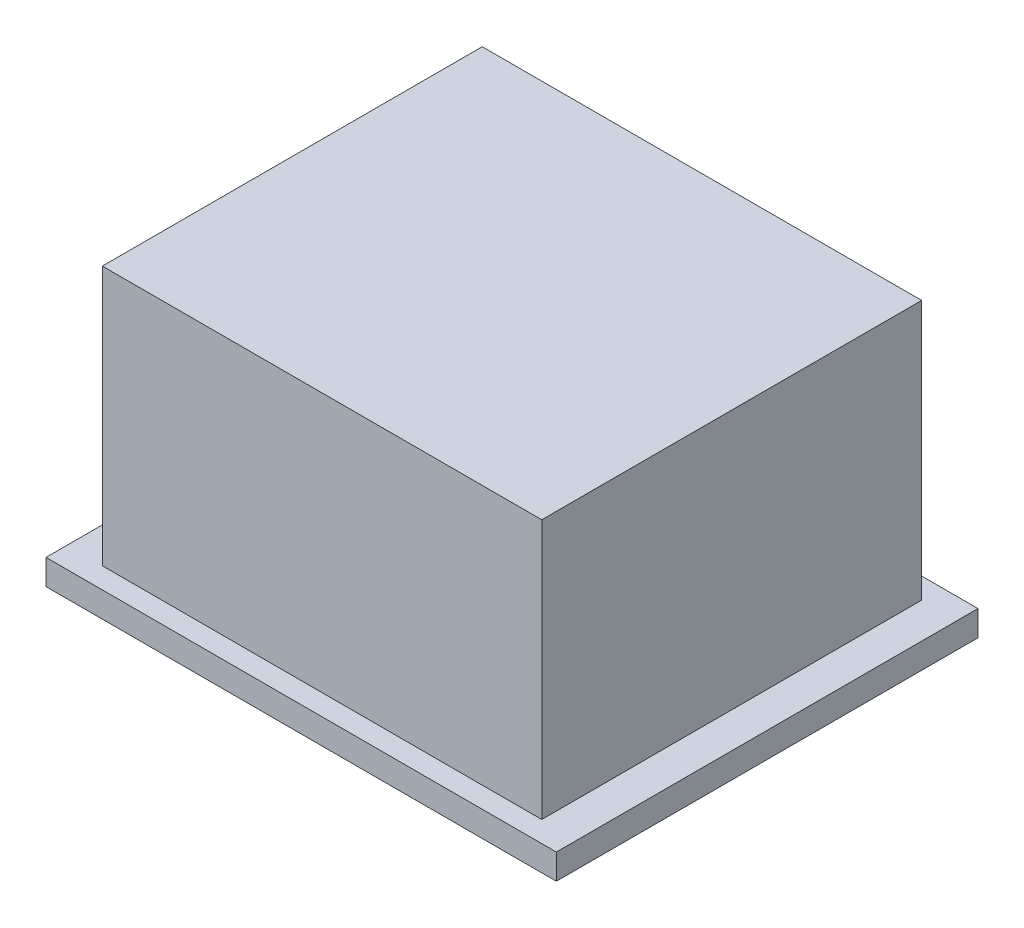
ISO-10303-21;
HEADER;
FILE_DESCRIPTION(('STEP AP214'),'2;1');
FILE_NAME('part.step','',(''),(''),'','','');
FILE_SCHEMA(('AUTOMOTIVE_DESIGN { 1 0 10303 214 1 1 1 1 }'));
ENDSEC;
DATA;
#1=APPLICATION_CONTEXT('core data for automotive mechanical design processes');
#2=APPLICATION_PROTOCOL_DEFINITION('international standard','automotive_design',2000,#1);
#3=PRODUCT_CONTEXT('',#1,'mechanical');
#4=PRODUCT('Part','Part','',(#3));
#5=PRODUCT_RELATED_PRODUCT_CATEGORY('part','',(#4));
#6=PRODUCT_DEFINITION_FORMATION('','',#4);
#7=PRODUCT_DEFINITION_CONTEXT('part definition',#1,'design');
#8=PRODUCT_DEFINITION('design','',#6,#7);
#9=PRODUCT_DEFINITION_SHAPE('','',#8);
#10=(LENGTH_UNIT() NAMED_UNIT(*) SI_UNIT(.MILLI.,.METRE.));
#11=(NAMED_UNIT(*) PLANE_ANGLE_UNIT() SI_UNIT($,.RADIAN.));
#12=(NAMED_UNIT(*) SI_UNIT($,.STERADIAN.) SOLID_ANGLE_UNIT());
#13=UNCERTAINTY_MEASURE_WITH_UNIT(LENGTH_MEASURE(1.E-05),#10,'distance_accuracy_value','');
#14=(GEOMETRIC_REPRESENTATION_CONTEXT(3) GLOBAL_UNCERTAINTY_ASSIGNED_CONTEXT((#13)) GLOBAL_UNIT_ASSIGNED_CONTEXT((#10,
#11,#12)) REPRESENTATION_CONTEXT('',''));
#15=CARTESIAN_POINT('',(0.,0.,0.));
#16=DIRECTION('',(0.,0.,1.));
#17=DIRECTION('',(1.,0.,0.));
#18=AXIS2_PLACEMENT_3D('',#15,#16,#17);
#19=CARTESIAN_POINT('',(0.,2.,0.));
#20=DIRECTION('',(0.,-1.,0.));
#21=DIRECTION('',(0.,0.,-1.));
#22=AXIS2_PLACEMENT_3D('',#19,#20,#21);
#23=PLANE('',#22);
#24=DIRECTION('',(0.,0.,1.));
#25=VECTOR('',#24,1.);
#26=CARTESIAN_POINT('',(0.,2.,0.));
#27=LINE('',#26,#25);
#28=CARTESIAN_POINT('',(0.,2.,-33.3));
#29=VERTEX_POINT('',#28);
#30=CARTESIAN_POINT('',(0.,2.,0.));
#31=VERTEX_POINT('',#30);
#32=EDGE_CURVE('E127',#29,#31,#27,.T.);
#33=ORIENTED_EDGE('',*,*,#32,.T.);
#34=DIRECTION('',(1.,0.,0.));
#35=VECTOR('',#34,1.);
#36=CARTESIAN_POINT('',(0.,2.,0.));
#37=LINE('',#36,#35);
#38=CARTESIAN_POINT('',(40.3,2.,0.));
#39=VERTEX_POINT('',#38);
#40=EDGE_CURVE('E130',#31,#39,#37,.T.);
#41=ORIENTED_EDGE('',*,*,#40,.T.);
#42=DIRECTION('',(0.,0.,-1.));
#43=VECTOR('',#42,1.);
#44=CARTESIAN_POINT('',(40.3,2.,0.));
#45=LINE('',#44,#43);
#46=CARTESIAN_POINT('',(40.3,2.,-33.3));
#47=VERTEX_POINT('',#46);
#48=EDGE_CURVE('E133',#39,#47,#45,.T.);
#49=ORIENTED_EDGE('',*,*,#48,.T.);
#50=DIRECTION('',(-1.,0.,0.));
#51=VECTOR('',#50,1.);
#52=CARTESIAN_POINT('',(0.,2.,-33.3));
#53=LINE('',#52,#51);
#54=EDGE_CURVE('E135',#47,#29,#53,.T.);
#55=ORIENTED_EDGE('',*,*,#54,.T.);
#56=EDGE_LOOP('',(#33,#41,#49,#55));
#57=FACE_BOUND('',#56,.T.);
#58=DIRECTION('',(0.,0.,-1.));
#59=VECTOR('',#58,1.);
#60=CARTESIAN_POINT('',(37.5,2.,-1.65000000000001));
#61=LINE('',#60,#59);
#62=CARTESIAN_POINT('',(37.5,2.,-1.65000000000001));
#63=VERTEX_POINT('',#62);
#64=CARTESIAN_POINT('',(37.5,2.,-31.65));
#65=VERTEX_POINT('',#64);
#66=EDGE_CURVE('E48',#63,#65,#61,.T.);
#67=ORIENTED_EDGE('',*,*,#66,.F.);
#68=DIRECTION('',(1.,0.,0.));
#69=VECTOR('',#68,1.);
#70=CARTESIAN_POINT('',(2.8,2.,-1.65000000000001));
#71=LINE('',#70,#69);
#72=CARTESIAN_POINT('',(2.8,2.,-1.65000000000001));
#73=VERTEX_POINT('',#72);
#74=EDGE_CURVE('E52',#73,#63,#71,.T.);
#75=ORIENTED_EDGE('',*,*,#74,.F.);
#76=DIRECTION('',(0.,0.,1.));
#77=VECTOR('',#76,1.);
#78=CARTESIAN_POINT('',(2.8,2.,-1.65000000000001));
#79=LINE('',#78,#77);
#80=CARTESIAN_POINT('',(2.8,2.,-31.65));
#81=VERTEX_POINT('',#80);
#82=EDGE_CURVE('E260',#81,#73,#79,.T.);
#83=ORIENTED_EDGE('',*,*,#82,.F.);
#84=DIRECTION('',(-1.,0.,0.));
#85=VECTOR('',#84,1.);
#86=CARTESIAN_POINT('',(2.8,2.,-31.65));
#87=LINE('',#86,#85);
#88=EDGE_CURVE('E266',#65,#81,#87,.T.);
#89=ORIENTED_EDGE('',*,*,#88,.F.);
#90=EDGE_LOOP('',(#67,#75,#83,#89));
#91=FACE_BOUND('',#90,.T.);
#92=ADVANCED_FACE('F33',(#57,#91),#23,.F.);
#93=CARTESIAN_POINT('',(0.,2.,0.));
#94=DIRECTION('',(1.,0.,0.));
#95=DIRECTION('',(0.,0.,-1.));
#96=AXIS2_PLACEMENT_3D('',#93,#94,#95);
#97=PLANE('',#96);
#98=DIRECTION('',(0.,0.,1.));
#99=VECTOR('',#98,1.);
#100=CARTESIAN_POINT('',(0.,0.,0.));
#101=LINE('',#100,#99);
#102=CARTESIAN_POINT('',(0.,0.,-33.3));
#103=VERTEX_POINT('',#102);
#104=CARTESIAN_POINT('',(0.,0.,0.));
#105=VERTEX_POINT('',#104);
#106=EDGE_CURVE('E118',#103,#105,#101,.T.);
#107=ORIENTED_EDGE('',*,*,#106,.T.);
#108=DIRECTION('',(0.,-1.,0.));
#109=VECTOR('',#108,1.);
#110=CARTESIAN_POINT('',(0.,2.,0.));
#111=LINE('',#110,#109);
#112=EDGE_CURVE('E11',#31,#105,#111,.T.);
#113=ORIENTED_EDGE('',*,*,#112,.F.);
#114=ORIENTED_EDGE('',*,*,#32,.F.);
#115=DIRECTION('',(0.,-1.,0.));
#116=VECTOR('',#115,1.);
#117=CARTESIAN_POINT('',(0.,2.,-33.3));
#118=LINE('',#117,#116);
#119=EDGE_CURVE('E136',#29,#103,#118,.T.);
#120=ORIENTED_EDGE('',*,*,#119,.T.);
#121=EDGE_LOOP('',(#107,#113,#114,#120));
#122=FACE_BOUND('',#121,.T.);
#123=ADVANCED_FACE('F35',(#122),#97,.F.);
#124=CARTESIAN_POINT('',(0.,2.,0.));
#125=DIRECTION('',(0.,0.,-1.));
#126=DIRECTION('',(-1.,0.,0.));
#127=AXIS2_PLACEMENT_3D('',#124,#125,#126);
#128=PLANE('',#127);
#129=DIRECTION('',(1.,0.,0.));
#130=VECTOR('',#129,1.);
#131=CARTESIAN_POINT('',(0.,0.,0.));
#132=LINE('',#131,#130);
#133=CARTESIAN_POINT('',(40.3,0.,0.));
#134=VERTEX_POINT('',#133);
#135=EDGE_CURVE('E121',#105,#134,#132,.T.);
#136=ORIENTED_EDGE('',*,*,#135,.T.);
#137=DIRECTION('',(0.,-1.,0.));
#138=VECTOR('',#137,1.);
#139=CARTESIAN_POINT('',(40.3,2.,0.));
#140=LINE('',#139,#138);
#141=EDGE_CURVE('E41',#39,#134,#140,.T.);
#142=ORIENTED_EDGE('',*,*,#141,.F.);
#143=ORIENTED_EDGE('',*,*,#40,.F.);
#144=ORIENTED_EDGE('',*,*,#112,.T.);
#145=EDGE_LOOP('',(#136,#142,#143,#144));
#146=FACE_BOUND('',#145,.T.);
#147=ADVANCED_FACE('F166',(#146),#128,.F.);
#148=CARTESIAN_POINT('',(40.3,2.,0.));
#149=DIRECTION('',(-1.,0.,0.));
#150=DIRECTION('',(0.,0.,1.));
#151=AXIS2_PLACEMENT_3D('',#148,#149,#150);
#152=PLANE('',#151);
#153=DIRECTION('',(0.,0.,-1.));
#154=VECTOR('',#153,1.);
#155=CARTESIAN_POINT('',(40.3,0.,0.));
#156=LINE('',#155,#154);
#157=CARTESIAN_POINT('',(40.3,0.,-33.3));
#158=VERTEX_POINT('',#157);
#159=EDGE_CURVE('E139',#134,#158,#156,.T.);
#160=ORIENTED_EDGE('',*,*,#159,.T.);
#161=DIRECTION('',(0.,-1.,0.));
#162=VECTOR('',#161,1.);
#163=CARTESIAN_POINT('',(40.3,2.,-33.3));
#164=LINE('',#163,#162);
#165=EDGE_CURVE('E144',#47,#158,#164,.T.);
#166=ORIENTED_EDGE('',*,*,#165,.F.);
#167=ORIENTED_EDGE('',*,*,#48,.F.);
#168=ORIENTED_EDGE('',*,*,#141,.T.);
#169=EDGE_LOOP('',(#160,#166,#167,#168));
#170=FACE_BOUND('',#169,.T.);
#171=ADVANCED_FACE('F151',(#170),#152,.F.);
#172=CARTESIAN_POINT('',(0.,2.,-33.3));
#173=DIRECTION('',(0.,0.,1.));
#174=DIRECTION('',(1.,0.,0.));
#175=AXIS2_PLACEMENT_3D('',#172,#173,#174);
#176=PLANE('',#175);
#177=DIRECTION('',(-1.,0.,0.));
#178=VECTOR('',#177,1.);
#179=CARTESIAN_POINT('',(0.,0.,-33.3));
#180=LINE('',#179,#178);
#181=EDGE_CURVE('E131',#158,#103,#180,.T.);
#182=ORIENTED_EDGE('',*,*,#181,.T.);
#183=ORIENTED_EDGE('',*,*,#119,.F.);
#184=ORIENTED_EDGE('',*,*,#54,.F.);
#185=ORIENTED_EDGE('',*,*,#165,.T.);
#186=EDGE_LOOP('',(#182,#183,#184,#185));
#187=FACE_BOUND('',#186,.T.);
#188=ADVANCED_FACE('F160',(#187),#176,.F.);
#189=CARTESIAN_POINT('',(0.,0.,0.));
#190=DIRECTION('',(0.,-1.,0.));
#191=DIRECTION('',(0.,0.,-1.));
#192=AXIS2_PLACEMENT_3D('',#189,#190,#191);
#193=PLANE('',#192);
#194=ORIENTED_EDGE('',*,*,#106,.F.);
#195=ORIENTED_EDGE('',*,*,#181,.F.);
#196=ORIENTED_EDGE('',*,*,#159,.F.);
#197=ORIENTED_EDGE('',*,*,#135,.F.);
#198=EDGE_LOOP('',(#194,#195,#196,#197));
#199=FACE_BOUND('',#198,.T.);
#200=ADVANCED_FACE('F157',(#199),#193,.T.);
#201=CARTESIAN_POINT('',(37.5,22.5,-1.65000000000001));
#202=DIRECTION('',(-1.,0.,0.));
#203=DIRECTION('',(0.,0.,1.));
#204=AXIS2_PLACEMENT_3D('',#201,#202,#203);
#205=PLANE('',#204);
#206=ORIENTED_EDGE('',*,*,#66,.T.);
#207=DIRECTION('',(0.,-1.,0.));
#208=VECTOR('',#207,1.);
#209=CARTESIAN_POINT('',(37.5,22.5,-31.65));
#210=LINE('',#209,#208);
#211=CARTESIAN_POINT('',(37.5,22.5,-31.65));
#212=VERTEX_POINT('',#211);
#213=EDGE_CURVE('E101',#212,#65,#210,.T.);
#214=ORIENTED_EDGE('',*,*,#213,.F.);
#215=DIRECTION('',(0.,0.,-1.));
#216=VECTOR('',#215,1.);
#217=CARTESIAN_POINT('',(37.5,22.5,-1.65000000000001));
#218=LINE('',#217,#216);
#219=CARTESIAN_POINT('',(37.5,22.5,-1.65000000000001));
#220=VERTEX_POINT('',#219);
#221=EDGE_CURVE('E107',#220,#212,#218,.T.);
#222=ORIENTED_EDGE('',*,*,#221,.F.);
#223=DIRECTION('',(0.,-1.,0.));
#224=VECTOR('',#223,1.);
#225=CARTESIAN_POINT('',(37.5,22.5,-1.65000000000001));
#226=LINE('',#225,#224);
#227=EDGE_CURVE('E258',#220,#63,#226,.T.);
#228=ORIENTED_EDGE('',*,*,#227,.T.);
#229=EDGE_LOOP('',(#206,#214,#222,#228));
#230=FACE_BOUND('',#229,.T.);
#231=ADVANCED_FACE('F117',(#230),#205,.F.);
#232=CARTESIAN_POINT('',(2.8,22.5,-31.65));
#233=DIRECTION('',(0.,0.,1.));
#234=DIRECTION('',(1.,0.,0.));
#235=AXIS2_PLACEMENT_3D('',#232,#233,#234);
#236=PLANE('',#235);
#237=ORIENTED_EDGE('',*,*,#88,.T.);
#238=DIRECTION('',(0.,-1.,0.));
#239=VECTOR('',#238,1.);
#240=CARTESIAN_POINT('',(2.8,22.5,-31.65));
#241=LINE('',#240,#239);
#242=CARTESIAN_POINT('',(2.8,22.5,-31.65));
#243=VERTEX_POINT('',#242);
#244=EDGE_CURVE('E103',#243,#81,#241,.T.);
#245=ORIENTED_EDGE('',*,*,#244,.F.);
#246=DIRECTION('',(-1.,0.,0.));
#247=VECTOR('',#246,1.);
#248=CARTESIAN_POINT('',(2.8,22.5,-31.65));
#249=LINE('',#248,#247);
#250=EDGE_CURVE('E96',#212,#243,#249,.T.);
#251=ORIENTED_EDGE('',*,*,#250,.F.);
#252=ORIENTED_EDGE('',*,*,#213,.T.);
#253=EDGE_LOOP('',(#237,#245,#251,#252));
#254=FACE_BOUND('',#253,.T.);
#255=ADVANCED_FACE('F99',(#254),#236,.F.);
#256=CARTESIAN_POINT('',(2.8,22.5,-1.65000000000001));
#257=DIRECTION('',(1.,0.,0.));
#258=DIRECTION('',(0.,0.,-1.));
#259=AXIS2_PLACEMENT_3D('',#256,#257,#258);
#260=PLANE('',#259);
#261=ORIENTED_EDGE('',*,*,#82,.T.);
#262=DIRECTION('',(0.,-1.,0.));
#263=VECTOR('',#262,1.);
#264=CARTESIAN_POINT('',(2.8,22.5,-1.65000000000001));
#265=LINE('',#264,#263);
#266=CARTESIAN_POINT('',(2.8,22.5,-1.65000000000001));
#267=VERTEX_POINT('',#266);
#268=EDGE_CURVE('E123',#267,#73,#265,.T.);
#269=ORIENTED_EDGE('',*,*,#268,.F.);
#270=DIRECTION('',(0.,0.,1.));
#271=VECTOR('',#270,1.);
#272=CARTESIAN_POINT('',(2.8,22.5,-1.65000000000001));
#273=LINE('',#272,#271);
#274=EDGE_CURVE('E106',#243,#267,#273,.T.);
#275=ORIENTED_EDGE('',*,*,#274,.F.);
#276=ORIENTED_EDGE('',*,*,#244,.T.);
#277=EDGE_LOOP('',(#261,#269,#275,#276));
#278=FACE_BOUND('',#277,.T.);
#279=ADVANCED_FACE('F202',(#278),#260,.F.);
#280=CARTESIAN_POINT('',(2.8,22.5,-1.65000000000001));
#281=DIRECTION('',(0.,0.,-1.));
#282=DIRECTION('',(-1.,0.,0.));
#283=AXIS2_PLACEMENT_3D('',#280,#281,#282);
#284=PLANE('',#283);
#285=ORIENTED_EDGE('',*,*,#74,.T.);
#286=ORIENTED_EDGE('',*,*,#227,.F.);
#287=DIRECTION('',(1.,0.,0.));
#288=VECTOR('',#287,1.);
#289=CARTESIAN_POINT('',(2.8,22.5,-1.65000000000001));
#290=LINE('',#289,#288);
#291=EDGE_CURVE('E112',#267,#220,#290,.T.);
#292=ORIENTED_EDGE('',*,*,#291,.F.);
#293=ORIENTED_EDGE('',*,*,#268,.T.);
#294=EDGE_LOOP('',(#285,#286,#292,#293));
#295=FACE_BOUND('',#294,.T.);
#296=ADVANCED_FACE('F208',(#295),#284,.F.);
#297=CARTESIAN_POINT('',(0.,22.5,0.));
#298=DIRECTION('',(0.,-1.,0.));
#299=DIRECTION('',(0.,0.,-1.));
#300=AXIS2_PLACEMENT_3D('',#297,#298,#299);
#301=PLANE('',#300);
#302=ORIENTED_EDGE('',*,*,#221,.T.);
#303=ORIENTED_EDGE('',*,*,#250,.T.);
#304=ORIENTED_EDGE('',*,*,#274,.T.);
#305=ORIENTED_EDGE('',*,*,#291,.T.);
#306=EDGE_LOOP('',(#302,#303,#304,#305));
#307=FACE_BOUND('',#306,.T.);
#308=ADVANCED_FACE('F110',(#307),#301,.F.);
#309=CLOSED_SHELL('',(#92,#123,#147,#171,#188,#200,#231,#255,#279,#296,#308));
#310=MANIFOLD_SOLID_BREP('B2',#309);
#311=ADVANCED_BREP_SHAPE_REPRESENTATION('',(#18,#310),#14);
#312=SHAPE_DEFINITION_REPRESENTATION(#9,#311);
ENDSEC;
END-ISO-10303-21;
